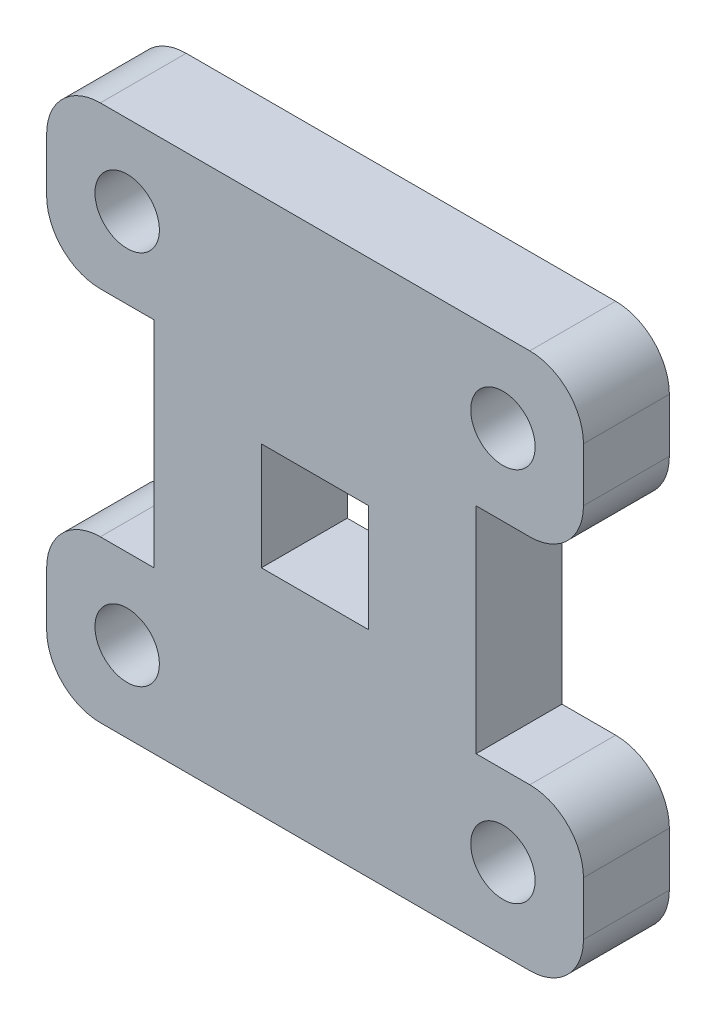
ISO-10303-21;
HEADER;
FILE_DESCRIPTION(('STEP AP214'),'2;1');
FILE_NAME('part.step','',(''),(''),'','','');
FILE_SCHEMA(('AUTOMOTIVE_DESIGN { 1 0 10303 214 1 1 1 1 }'));
ENDSEC;
DATA;
#1=APPLICATION_CONTEXT('core data for automotive mechanical design processes');
#2=APPLICATION_PROTOCOL_DEFINITION('international standard','automotive_design',2000,#1);
#3=PRODUCT_CONTEXT('',#1,'mechanical');
#4=PRODUCT('Part','Part','',(#3));
#5=PRODUCT_RELATED_PRODUCT_CATEGORY('part','',(#4));
#6=PRODUCT_DEFINITION_FORMATION('','',#4);
#7=PRODUCT_DEFINITION_CONTEXT('part definition',#1,'design');
#8=PRODUCT_DEFINITION('design','',#6,#7);
#9=PRODUCT_DEFINITION_SHAPE('','',#8);
#10=(LENGTH_UNIT() NAMED_UNIT(*) SI_UNIT(.MILLI.,.METRE.));
#11=(NAMED_UNIT(*) PLANE_ANGLE_UNIT() SI_UNIT($,.RADIAN.));
#12=(NAMED_UNIT(*) SI_UNIT($,.STERADIAN.) SOLID_ANGLE_UNIT());
#13=UNCERTAINTY_MEASURE_WITH_UNIT(LENGTH_MEASURE(1.E-05),#10,'distance_accuracy_value','');
#14=(GEOMETRIC_REPRESENTATION_CONTEXT(3) GLOBAL_UNCERTAINTY_ASSIGNED_CONTEXT((#13)) GLOBAL_UNIT_ASSIGNED_CONTEXT((#10,
#11,#12)) REPRESENTATION_CONTEXT('',''));
#15=CARTESIAN_POINT('',(0.,0.,0.));
#16=DIRECTION('',(0.,0.,1.));
#17=DIRECTION('',(1.,0.,0.));
#18=AXIS2_PLACEMENT_3D('',#15,#16,#17);
#19=CARTESIAN_POINT('',(-40.,-30.,16.));
#20=DIRECTION('',(0.,0.,-1.));
#21=DIRECTION('',(-1.,0.,0.));
#22=AXIS2_PLACEMENT_3D('',#19,#20,#21);
#23=PLANE('',#22);
#24=CARTESIAN_POINT('',(-35.,35.,16.));
#25=DIRECTION('',(0.,0.,1.));
#26=DIRECTION('',(-1.,0.,0.));
#27=AXIS2_PLACEMENT_3D('',#24,#25,#26);
#28=CIRCLE('',#27,6.00000000000001);
#29=CARTESIAN_POINT('',(-41.,35.,16.));
#30=VERTEX_POINT('',#29);
#31=EDGE_CURVE('E233',#30,#30,#28,.T.);
#32=ORIENTED_EDGE('',*,*,#31,.F.);
#33=EDGE_LOOP('',(#32));
#34=FACE_BOUND('',#33,.T.);
#35=CARTESIAN_POINT('',(35.,35.,16.));
#36=DIRECTION('',(0.,0.,1.));
#37=DIRECTION('',(1.,0.,0.));
#38=AXIS2_PLACEMENT_3D('',#35,#36,#37);
#39=CIRCLE('',#38,6.00000000000001);
#40=CARTESIAN_POINT('',(41.,35.,16.));
#41=VERTEX_POINT('',#40);
#42=EDGE_CURVE('E239',#41,#41,#39,.T.);
#43=ORIENTED_EDGE('',*,*,#42,.F.);
#44=EDGE_LOOP('',(#43));
#45=FACE_BOUND('',#44,.T.);
#46=DIRECTION('',(0.,-1.,0.));
#47=VECTOR('',#46,1.);
#48=CARTESIAN_POINT('',(-30.,20.,16.));
#49=LINE('',#48,#47);
#50=CARTESIAN_POINT('',(-30.,20.,16.));
#51=VERTEX_POINT('',#50);
#52=CARTESIAN_POINT('',(-30.,-20.,16.));
#53=VERTEX_POINT('',#52);
#54=EDGE_CURVE('E245',#51,#53,#49,.T.);
#55=ORIENTED_EDGE('',*,*,#54,.T.);
#56=DIRECTION('',(-1.,0.,0.));
#57=VECTOR('',#56,1.);
#58=CARTESIAN_POINT('',(-39.9999999999999,-20.,16.));
#59=LINE('',#58,#57);
#60=CARTESIAN_POINT('',(-39.9999999999999,-20.,16.));
#61=VERTEX_POINT('',#60);
#62=EDGE_CURVE('E248',#53,#61,#59,.T.);
#63=ORIENTED_EDGE('',*,*,#62,.T.);
#64=CARTESIAN_POINT('',(-40.,-30.,16.));
#65=DIRECTION('',(0.,0.,1.));
#66=DIRECTION('',(-1.,0.,0.));
#67=AXIS2_PLACEMENT_3D('',#64,#65,#66);
#68=CIRCLE('',#67,10.);
#69=CARTESIAN_POINT('',(-50.,-30.0000000000001,16.));
#70=VERTEX_POINT('',#69);
#71=EDGE_CURVE('E251',#61,#70,#68,.T.);
#72=ORIENTED_EDGE('',*,*,#71,.T.);
#73=DIRECTION('',(0.,-1.,0.));
#74=VECTOR('',#73,1.);
#75=CARTESIAN_POINT('',(-50.,-30.0000000000001,16.));
#76=LINE('',#75,#74);
#77=CARTESIAN_POINT('',(-50.,-39.9999999999999,16.));
#78=VERTEX_POINT('',#77);
#79=EDGE_CURVE('E253',#70,#78,#76,.T.);
#80=ORIENTED_EDGE('',*,*,#79,.T.);
#81=CARTESIAN_POINT('',(-40.,-40.,16.));
#82=DIRECTION('',(0.,0.,1.));
#83=DIRECTION('',(1.,0.,0.));
#84=AXIS2_PLACEMENT_3D('',#81,#82,#83);
#85=CIRCLE('',#84,10.);
#86=CARTESIAN_POINT('',(-39.9999999999999,-50.,16.));
#87=VERTEX_POINT('',#86);
#88=EDGE_CURVE('E255',#78,#87,#85,.T.);
#89=ORIENTED_EDGE('',*,*,#88,.T.);
#90=DIRECTION('',(1.,0.,0.));
#91=VECTOR('',#90,1.);
#92=CARTESIAN_POINT('',(-39.9999999999999,-50.,16.));
#93=LINE('',#92,#91);
#94=CARTESIAN_POINT('',(39.9999999999999,-50.,16.));
#95=VERTEX_POINT('',#94);
#96=EDGE_CURVE('E257',#87,#95,#93,.T.);
#97=ORIENTED_EDGE('',*,*,#96,.T.);
#98=CARTESIAN_POINT('',(40.,-40.,16.));
#99=DIRECTION('',(0.,0.,1.));
#100=DIRECTION('',(1.,0.,0.));
#101=AXIS2_PLACEMENT_3D('',#98,#99,#100);
#102=CIRCLE('',#101,10.);
#103=CARTESIAN_POINT('',(50.,-39.9999999999999,16.));
#104=VERTEX_POINT('',#103);
#105=EDGE_CURVE('E259',#95,#104,#102,.T.);
#106=ORIENTED_EDGE('',*,*,#105,.T.);
#107=DIRECTION('',(0.,1.,0.));
#108=VECTOR('',#107,1.);
#109=CARTESIAN_POINT('',(50.,-30.0000000000001,16.));
#110=LINE('',#109,#108);
#111=CARTESIAN_POINT('',(50.,-30.0000000000001,16.));
#112=VERTEX_POINT('',#111);
#113=EDGE_CURVE('E261',#104,#112,#110,.T.);
#114=ORIENTED_EDGE('',*,*,#113,.T.);
#115=CARTESIAN_POINT('',(40.,-30.,16.));
#116=DIRECTION('',(0.,0.,1.));
#117=DIRECTION('',(1.,0.,0.));
#118=AXIS2_PLACEMENT_3D('',#115,#116,#117);
#119=CIRCLE('',#118,10.);
#120=CARTESIAN_POINT('',(39.9999999999999,-20.,16.));
#121=VERTEX_POINT('',#120);
#122=EDGE_CURVE('E263',#112,#121,#119,.T.);
#123=ORIENTED_EDGE('',*,*,#122,.T.);
#124=DIRECTION('',(-1.,0.,0.));
#125=VECTOR('',#124,1.);
#126=CARTESIAN_POINT('',(39.9999999999999,-20.,16.));
#127=LINE('',#126,#125);
#128=CARTESIAN_POINT('',(30.,-20.,16.));
#129=VERTEX_POINT('',#128);
#130=EDGE_CURVE('E265',#121,#129,#127,.T.);
#131=ORIENTED_EDGE('',*,*,#130,.T.);
#132=DIRECTION('',(0.,1.,0.));
#133=VECTOR('',#132,1.);
#134=CARTESIAN_POINT('',(30.,20.,16.));
#135=LINE('',#134,#133);
#136=CARTESIAN_POINT('',(30.,20.,16.));
#137=VERTEX_POINT('',#136);
#138=EDGE_CURVE('E267',#129,#137,#135,.T.);
#139=ORIENTED_EDGE('',*,*,#138,.T.);
#140=DIRECTION('',(1.,0.,0.));
#141=VECTOR('',#140,1.);
#142=CARTESIAN_POINT('',(39.9999999999999,20.,16.));
#143=LINE('',#142,#141);
#144=CARTESIAN_POINT('',(39.9999999999999,20.,16.));
#145=VERTEX_POINT('',#144);
#146=EDGE_CURVE('E269',#137,#145,#143,.T.);
#147=ORIENTED_EDGE('',*,*,#146,.T.);
#148=CARTESIAN_POINT('',(40.,30.,16.));
#149=DIRECTION('',(0.,0.,1.));
#150=DIRECTION('',(-1.,0.,0.));
#151=AXIS2_PLACEMENT_3D('',#148,#149,#150);
#152=CIRCLE('',#151,10.);
#153=CARTESIAN_POINT('',(50.,30.0000000000001,16.));
#154=VERTEX_POINT('',#153);
#155=EDGE_CURVE('E271',#145,#154,#152,.T.);
#156=ORIENTED_EDGE('',*,*,#155,.T.);
#157=DIRECTION('',(0.,1.,0.));
#158=VECTOR('',#157,1.);
#159=CARTESIAN_POINT('',(50.,30.0000000000001,16.));
#160=LINE('',#159,#158);
#161=CARTESIAN_POINT('',(50.,39.9999999999999,16.));
#162=VERTEX_POINT('',#161);
#163=EDGE_CURVE('E273',#154,#162,#160,.T.);
#164=ORIENTED_EDGE('',*,*,#163,.T.);
#165=CARTESIAN_POINT('',(40.,40.,16.));
#166=DIRECTION('',(0.,0.,1.));
#167=DIRECTION('',(-1.,0.,0.));
#168=AXIS2_PLACEMENT_3D('',#165,#166,#167);
#169=CIRCLE('',#168,10.);
#170=CARTESIAN_POINT('',(39.9999999999999,50.,16.));
#171=VERTEX_POINT('',#170);
#172=EDGE_CURVE('E275',#162,#171,#169,.T.);
#173=ORIENTED_EDGE('',*,*,#172,.T.);
#174=DIRECTION('',(-1.,0.,0.));
#175=VECTOR('',#174,1.);
#176=CARTESIAN_POINT('',(-39.9999999999999,50.,16.));
#177=LINE('',#176,#175);
#178=CARTESIAN_POINT('',(-39.9999999999999,50.,16.));
#179=VERTEX_POINT('',#178);
#180=EDGE_CURVE('E277',#171,#179,#177,.T.);
#181=ORIENTED_EDGE('',*,*,#180,.T.);
#182=CARTESIAN_POINT('',(-40.,40.,16.));
#183=DIRECTION('',(0.,0.,1.));
#184=DIRECTION('',(-1.,0.,0.));
#185=AXIS2_PLACEMENT_3D('',#182,#183,#184);
#186=CIRCLE('',#185,10.);
#187=CARTESIAN_POINT('',(-50.,39.9999999999999,16.));
#188=VERTEX_POINT('',#187);
#189=EDGE_CURVE('E279',#179,#188,#186,.T.);
#190=ORIENTED_EDGE('',*,*,#189,.T.);
#191=DIRECTION('',(0.,-1.,0.));
#192=VECTOR('',#191,1.);
#193=CARTESIAN_POINT('',(-50.,30.0000000000001,16.));
#194=LINE('',#193,#192);
#195=CARTESIAN_POINT('',(-50.,30.0000000000001,16.));
#196=VERTEX_POINT('',#195);
#197=EDGE_CURVE('E281',#188,#196,#194,.T.);
#198=ORIENTED_EDGE('',*,*,#197,.T.);
#199=CARTESIAN_POINT('',(-40.,30.,16.));
#200=DIRECTION('',(0.,0.,1.));
#201=DIRECTION('',(1.,0.,0.));
#202=AXIS2_PLACEMENT_3D('',#199,#200,#201);
#203=CIRCLE('',#202,10.);
#204=CARTESIAN_POINT('',(-39.9999999999999,20.,16.));
#205=VERTEX_POINT('',#204);
#206=EDGE_CURVE('E283',#196,#205,#203,.T.);
#207=ORIENTED_EDGE('',*,*,#206,.T.);
#208=DIRECTION('',(1.,0.,0.));
#209=VECTOR('',#208,1.);
#210=CARTESIAN_POINT('',(-39.9999999999999,20.,16.));
#211=LINE('',#210,#209);
#212=EDGE_CURVE('E285',#205,#51,#211,.T.);
#213=ORIENTED_EDGE('',*,*,#212,.T.);
#214=EDGE_LOOP('',(#55,#63,#72,#80,#89,#97,#106,#114,#123,#131,#139,#147,#156,#164,#173,#181,
#190,#198,#207,#213));
#215=FACE_BOUND('',#214,.T.);
#216=DIRECTION('',(1.,0.,0.));
#217=VECTOR('',#216,1.);
#218=CARTESIAN_POINT('',(10.,-10.,16.));
#219=LINE('',#218,#217);
#220=CARTESIAN_POINT('',(-10.,-10.,16.));
#221=VERTEX_POINT('',#220);
#222=CARTESIAN_POINT('',(10.,-10.,16.));
#223=VERTEX_POINT('',#222);
#224=EDGE_CURVE('E194',#221,#223,#219,.T.);
#225=ORIENTED_EDGE('',*,*,#224,.F.);
#226=DIRECTION('',(0.,-1.,0.));
#227=VECTOR('',#226,1.);
#228=CARTESIAN_POINT('',(-10.,10.,16.));
#229=LINE('',#228,#227);
#230=CARTESIAN_POINT('',(-10.,9.99999999999999,16.));
#231=VERTEX_POINT('',#230);
#232=EDGE_CURVE('E217',#231,#221,#229,.T.);
#233=ORIENTED_EDGE('',*,*,#232,.F.);
#234=DIRECTION('',(-1.,0.,0.));
#235=VECTOR('',#234,1.);
#236=CARTESIAN_POINT('',(10.,10.,16.));
#237=LINE('',#236,#235);
#238=CARTESIAN_POINT('',(10.,10.,16.));
#239=VERTEX_POINT('',#238);
#240=EDGE_CURVE('E215',#239,#231,#237,.T.);
#241=ORIENTED_EDGE('',*,*,#240,.F.);
#242=DIRECTION('',(0.,1.,0.));
#243=VECTOR('',#242,1.);
#244=CARTESIAN_POINT('',(10.,-10.,16.));
#245=LINE('',#244,#243);
#246=EDGE_CURVE('E202',#223,#239,#245,.T.);
#247=ORIENTED_EDGE('',*,*,#246,.F.);
#248=EDGE_LOOP('',(#225,#233,#241,#247));
#249=FACE_BOUND('',#248,.T.);
#250=CARTESIAN_POINT('',(35.,-35.,16.));
#251=DIRECTION('',(0.,0.,1.));
#252=DIRECTION('',(-1.,0.,0.));
#253=AXIS2_PLACEMENT_3D('',#250,#251,#252);
#254=CIRCLE('',#253,6.00000000000001);
#255=CARTESIAN_POINT('',(29.,-35.,16.));
#256=VERTEX_POINT('',#255);
#257=EDGE_CURVE('E223',#256,#256,#254,.T.);
#258=ORIENTED_EDGE('',*,*,#257,.F.);
#259=EDGE_LOOP('',(#258));
#260=FACE_BOUND('',#259,.T.);
#261=CARTESIAN_POINT('',(-35.,-35.,16.));
#262=DIRECTION('',(0.,0.,1.));
#263=DIRECTION('',(1.,0.,0.));
#264=AXIS2_PLACEMENT_3D('',#261,#262,#263);
#265=CIRCLE('',#264,6.00000000000001);
#266=CARTESIAN_POINT('',(-29.,-35.,16.));
#267=VERTEX_POINT('',#266);
#268=EDGE_CURVE('E737',#267,#267,#265,.T.);
#269=ORIENTED_EDGE('',*,*,#268,.F.);
#270=EDGE_LOOP('',(#269));
#271=FACE_BOUND('',#270,.T.);
#272=ADVANCED_FACE('F33',(#34,#45,#215,#249,#260,#271),#23,.F.);
#273=CARTESIAN_POINT('',(-40.,-30.,0.));
#274=DIRECTION('',(0.,0.,-1.));
#275=DIRECTION('',(-1.,0.,0.));
#276=AXIS2_PLACEMENT_3D('',#273,#274,#275);
#277=PLANE('',#276);
#278=CARTESIAN_POINT('',(35.,-35.,0.));
#279=DIRECTION('',(0.,0.,1.));
#280=DIRECTION('',(-1.,0.,0.));
#281=AXIS2_PLACEMENT_3D('',#278,#279,#280);
#282=CIRCLE('',#281,6.00000000000001);
#283=CARTESIAN_POINT('',(29.,-35.,0.));
#284=VERTEX_POINT('',#283);
#285=EDGE_CURVE('E743',#284,#284,#282,.T.);
#286=ORIENTED_EDGE('',*,*,#285,.T.);
#287=EDGE_LOOP('',(#286));
#288=FACE_BOUND('',#287,.T.);
#289=CARTESIAN_POINT('',(35.,35.,0.));
#290=DIRECTION('',(0.,0.,1.));
#291=DIRECTION('',(1.,0.,0.));
#292=AXIS2_PLACEMENT_3D('',#289,#290,#291);
#293=CIRCLE('',#292,6.00000000000001);
#294=CARTESIAN_POINT('',(41.,35.,0.));
#295=VERTEX_POINT('',#294);
#296=EDGE_CURVE('E236',#295,#295,#293,.T.);
#297=ORIENTED_EDGE('',*,*,#296,.T.);
#298=EDGE_LOOP('',(#297));
#299=FACE_BOUND('',#298,.T.);
#300=DIRECTION('',(0.,-1.,0.));
#301=VECTOR('',#300,1.);
#302=CARTESIAN_POINT('',(-30.,20.,0.));
#303=LINE('',#302,#301);
#304=CARTESIAN_POINT('',(-30.,20.,0.));
#305=VERTEX_POINT('',#304);
#306=CARTESIAN_POINT('',(-30.,-20.,0.));
#307=VERTEX_POINT('',#306);
#308=EDGE_CURVE('E242',#305,#307,#303,.T.);
#309=ORIENTED_EDGE('',*,*,#308,.F.);
#310=DIRECTION('',(1.,0.,0.));
#311=VECTOR('',#310,1.);
#312=CARTESIAN_POINT('',(-39.9999999999999,20.,0.));
#313=LINE('',#312,#311);
#314=CARTESIAN_POINT('',(-39.9999999999999,20.,0.));
#315=VERTEX_POINT('',#314);
#316=EDGE_CURVE('E249',#315,#305,#313,.T.);
#317=ORIENTED_EDGE('',*,*,#316,.F.);
#318=CARTESIAN_POINT('',(-40.,30.,0.));
#319=DIRECTION('',(0.,0.,1.));
#320=DIRECTION('',(1.,0.,0.));
#321=AXIS2_PLACEMENT_3D('',#318,#319,#320);
#322=CIRCLE('',#321,10.);
#323=CARTESIAN_POINT('',(-50.,30.0000000000001,0.));
#324=VERTEX_POINT('',#323);
#325=EDGE_CURVE('E324',#324,#315,#322,.T.);
#326=ORIENTED_EDGE('',*,*,#325,.F.);
#327=DIRECTION('',(0.,-1.,0.));
#328=VECTOR('',#327,1.);
#329=CARTESIAN_POINT('',(-50.,30.0000000000001,0.));
#330=LINE('',#329,#328);
#331=CARTESIAN_POINT('',(-50.,39.9999999999999,0.));
#332=VERTEX_POINT('',#331);
#333=EDGE_CURVE('E322',#332,#324,#330,.T.);
#334=ORIENTED_EDGE('',*,*,#333,.F.);
#335=CARTESIAN_POINT('',(-40.,40.,0.));
#336=DIRECTION('',(0.,0.,1.));
#337=DIRECTION('',(-1.,0.,0.));
#338=AXIS2_PLACEMENT_3D('',#335,#336,#337);
#339=CIRCLE('',#338,10.);
#340=CARTESIAN_POINT('',(-39.9999999999999,50.,0.));
#341=VERTEX_POINT('',#340);
#342=EDGE_CURVE('E320',#341,#332,#339,.T.);
#343=ORIENTED_EDGE('',*,*,#342,.F.);
#344=DIRECTION('',(-1.,0.,0.));
#345=VECTOR('',#344,1.);
#346=CARTESIAN_POINT('',(-39.9999999999999,50.,0.));
#347=LINE('',#346,#345);
#348=CARTESIAN_POINT('',(39.9999999999999,50.,0.));
#349=VERTEX_POINT('',#348);
#350=EDGE_CURVE('E318',#349,#341,#347,.T.);
#351=ORIENTED_EDGE('',*,*,#350,.F.);
#352=CARTESIAN_POINT('',(40.,40.,0.));
#353=DIRECTION('',(0.,0.,1.));
#354=DIRECTION('',(-1.,0.,0.));
#355=AXIS2_PLACEMENT_3D('',#352,#353,#354);
#356=CIRCLE('',#355,10.);
#357=CARTESIAN_POINT('',(50.,39.9999999999999,0.));
#358=VERTEX_POINT('',#357);
#359=EDGE_CURVE('E316',#358,#349,#356,.T.);
#360=ORIENTED_EDGE('',*,*,#359,.F.);
#361=DIRECTION('',(0.,1.,0.));
#362=VECTOR('',#361,1.);
#363=CARTESIAN_POINT('',(50.,30.0000000000001,0.));
#364=LINE('',#363,#362);
#365=CARTESIAN_POINT('',(50.,30.0000000000001,0.));
#366=VERTEX_POINT('',#365);
#367=EDGE_CURVE('E314',#366,#358,#364,.T.);
#368=ORIENTED_EDGE('',*,*,#367,.F.);
#369=CARTESIAN_POINT('',(40.,30.,0.));
#370=DIRECTION('',(0.,0.,1.));
#371=DIRECTION('',(-1.,0.,0.));
#372=AXIS2_PLACEMENT_3D('',#369,#370,#371);
#373=CIRCLE('',#372,10.);
#374=CARTESIAN_POINT('',(39.9999999999999,20.,0.));
#375=VERTEX_POINT('',#374);
#376=EDGE_CURVE('E312',#375,#366,#373,.T.);
#377=ORIENTED_EDGE('',*,*,#376,.F.);
#378=DIRECTION('',(1.,0.,0.));
#379=VECTOR('',#378,1.);
#380=CARTESIAN_POINT('',(39.9999999999999,20.,0.));
#381=LINE('',#380,#379);
#382=CARTESIAN_POINT('',(30.,20.,0.));
#383=VERTEX_POINT('',#382);
#384=EDGE_CURVE('E310',#383,#375,#381,.T.);
#385=ORIENTED_EDGE('',*,*,#384,.F.);
#386=DIRECTION('',(0.,1.,0.));
#387=VECTOR('',#386,1.);
#388=CARTESIAN_POINT('',(30.,20.,0.));
#389=LINE('',#388,#387);
#390=CARTESIAN_POINT('',(30.,-20.,0.));
#391=VERTEX_POINT('',#390);
#392=EDGE_CURVE('E308',#391,#383,#389,.T.);
#393=ORIENTED_EDGE('',*,*,#392,.F.);
#394=DIRECTION('',(-1.,0.,0.));
#395=VECTOR('',#394,1.);
#396=CARTESIAN_POINT('',(39.9999999999999,-20.,0.));
#397=LINE('',#396,#395);
#398=CARTESIAN_POINT('',(39.9999999999999,-20.,0.));
#399=VERTEX_POINT('',#398);
#400=EDGE_CURVE('E306',#399,#391,#397,.T.);
#401=ORIENTED_EDGE('',*,*,#400,.F.);
#402=CARTESIAN_POINT('',(40.,-30.,0.));
#403=DIRECTION('',(0.,0.,1.));
#404=DIRECTION('',(1.,0.,0.));
#405=AXIS2_PLACEMENT_3D('',#402,#403,#404);
#406=CIRCLE('',#405,10.);
#407=CARTESIAN_POINT('',(50.,-30.0000000000001,0.));
#408=VERTEX_POINT('',#407);
#409=EDGE_CURVE('E304',#408,#399,#406,.T.);
#410=ORIENTED_EDGE('',*,*,#409,.F.);
#411=DIRECTION('',(0.,1.,0.));
#412=VECTOR('',#411,1.);
#413=CARTESIAN_POINT('',(50.,-30.0000000000001,0.));
#414=LINE('',#413,#412);
#415=CARTESIAN_POINT('',(50.,-39.9999999999999,0.));
#416=VERTEX_POINT('',#415);
#417=EDGE_CURVE('E302',#416,#408,#414,.T.);
#418=ORIENTED_EDGE('',*,*,#417,.F.);
#419=CARTESIAN_POINT('',(40.,-40.,0.));
#420=DIRECTION('',(0.,0.,1.));
#421=DIRECTION('',(1.,0.,0.));
#422=AXIS2_PLACEMENT_3D('',#419,#420,#421);
#423=CIRCLE('',#422,10.);
#424=CARTESIAN_POINT('',(39.9999999999999,-50.,0.));
#425=VERTEX_POINT('',#424);
#426=EDGE_CURVE('E300',#425,#416,#423,.T.);
#427=ORIENTED_EDGE('',*,*,#426,.F.);
#428=DIRECTION('',(1.,0.,0.));
#429=VECTOR('',#428,1.);
#430=CARTESIAN_POINT('',(-39.9999999999999,-50.,0.));
#431=LINE('',#430,#429);
#432=CARTESIAN_POINT('',(-39.9999999999999,-50.,0.));
#433=VERTEX_POINT('',#432);
#434=EDGE_CURVE('E298',#433,#425,#431,.T.);
#435=ORIENTED_EDGE('',*,*,#434,.F.);
#436=CARTESIAN_POINT('',(-40.,-40.,0.));
#437=DIRECTION('',(0.,0.,1.));
#438=DIRECTION('',(1.,0.,0.));
#439=AXIS2_PLACEMENT_3D('',#436,#437,#438);
#440=CIRCLE('',#439,10.);
#441=CARTESIAN_POINT('',(-50.,-39.9999999999999,0.));
#442=VERTEX_POINT('',#441);
#443=EDGE_CURVE('E296',#442,#433,#440,.T.);
#444=ORIENTED_EDGE('',*,*,#443,.F.);
#445=DIRECTION('',(0.,-1.,0.));
#446=VECTOR('',#445,1.);
#447=CARTESIAN_POINT('',(-50.,-30.0000000000001,0.));
#448=LINE('',#447,#446);
#449=CARTESIAN_POINT('',(-50.,-30.0000000000001,0.));
#450=VERTEX_POINT('',#449);
#451=EDGE_CURVE('E294',#450,#442,#448,.T.);
#452=ORIENTED_EDGE('',*,*,#451,.F.);
#453=CARTESIAN_POINT('',(-40.,-30.,0.));
#454=DIRECTION('',(0.,0.,1.));
#455=DIRECTION('',(-1.,0.,0.));
#456=AXIS2_PLACEMENT_3D('',#453,#454,#455);
#457=CIRCLE('',#456,10.);
#458=CARTESIAN_POINT('',(-39.9999999999999,-20.,0.));
#459=VERTEX_POINT('',#458);
#460=EDGE_CURVE('E292',#459,#450,#457,.T.);
#461=ORIENTED_EDGE('',*,*,#460,.F.);
#462=DIRECTION('',(-1.,0.,0.));
#463=VECTOR('',#462,1.);
#464=CARTESIAN_POINT('',(-39.9999999999999,-20.,0.));
#465=LINE('',#464,#463);
#466=EDGE_CURVE('E290',#307,#459,#465,.T.);
#467=ORIENTED_EDGE('',*,*,#466,.F.);
#468=EDGE_LOOP('',(#309,#317,#326,#334,#343,#351,#360,#368,#377,#385,#393,#401,#410,#418,#427,
#435,#444,#452,#461,#467));
#469=FACE_BOUND('',#468,.T.);
#470=CARTESIAN_POINT('',(-35.,35.,0.));
#471=DIRECTION('',(0.,0.,1.));
#472=DIRECTION('',(-1.,0.,0.));
#473=AXIS2_PLACEMENT_3D('',#470,#471,#472);
#474=CIRCLE('',#473,6.00000000000001);
#475=CARTESIAN_POINT('',(-41.,35.,0.));
#476=VERTEX_POINT('',#475);
#477=EDGE_CURVE('E210',#476,#476,#474,.T.);
#478=ORIENTED_EDGE('',*,*,#477,.T.);
#479=EDGE_LOOP('',(#478));
#480=FACE_BOUND('',#479,.T.);
#481=DIRECTION('',(0.,-1.,0.));
#482=VECTOR('',#481,1.);
#483=CARTESIAN_POINT('',(-10.,10.,0.));
#484=LINE('',#483,#482);
#485=CARTESIAN_POINT('',(-10.,10.,0.));
#486=VERTEX_POINT('',#485);
#487=CARTESIAN_POINT('',(-10.,-9.99999999999999,0.));
#488=VERTEX_POINT('',#487);
#489=EDGE_CURVE('E203',#486,#488,#484,.T.);
#490=ORIENTED_EDGE('',*,*,#489,.T.);
#491=DIRECTION('',(1.,0.,0.));
#492=VECTOR('',#491,1.);
#493=CARTESIAN_POINT('',(10.,-10.,0.));
#494=LINE('',#493,#492);
#495=CARTESIAN_POINT('',(10.,-10.,0.));
#496=VERTEX_POINT('',#495);
#497=EDGE_CURVE('E56',#488,#496,#494,.T.);
#498=ORIENTED_EDGE('',*,*,#497,.T.);
#499=DIRECTION('',(0.,1.,0.));
#500=VECTOR('',#499,1.);
#501=CARTESIAN_POINT('',(10.,-10.,0.));
#502=LINE('',#501,#500);
#503=CARTESIAN_POINT('',(10.,10.,0.));
#504=VERTEX_POINT('',#503);
#505=EDGE_CURVE('E209',#496,#504,#502,.T.);
#506=ORIENTED_EDGE('',*,*,#505,.T.);
#507=DIRECTION('',(-1.,0.,0.));
#508=VECTOR('',#507,1.);
#509=CARTESIAN_POINT('',(10.,10.,0.));
#510=LINE('',#509,#508);
#511=EDGE_CURVE('E225',#504,#486,#510,.T.);
#512=ORIENTED_EDGE('',*,*,#511,.T.);
#513=EDGE_LOOP('',(#490,#498,#506,#512));
#514=FACE_BOUND('',#513,.T.);
#515=CARTESIAN_POINT('',(-35.,-35.,0.));
#516=DIRECTION('',(0.,0.,1.));
#517=DIRECTION('',(1.,0.,0.));
#518=AXIS2_PLACEMENT_3D('',#515,#516,#517);
#519=CIRCLE('',#518,6.00000000000001);
#520=CARTESIAN_POINT('',(-29.,-35.,0.));
#521=VERTEX_POINT('',#520);
#522=EDGE_CURVE('E740',#521,#521,#519,.T.);
#523=ORIENTED_EDGE('',*,*,#522,.T.);
#524=EDGE_LOOP('',(#523));
#525=FACE_BOUND('',#524,.T.);
#526=ADVANCED_FACE('F390',(#288,#299,#469,#480,#514,#525),#277,.T.);
#527=CARTESIAN_POINT('',(-30.,20.,16.));
#528=DIRECTION('',(1.,0.,0.));
#529=DIRECTION('',(0.,0.,-1.));
#530=AXIS2_PLACEMENT_3D('',#527,#528,#529);
#531=PLANE('',#530);
#532=ORIENTED_EDGE('',*,*,#308,.T.);
#533=DIRECTION('',(0.,0.,-1.));
#534=VECTOR('',#533,1.);
#535=CARTESIAN_POINT('',(-30.,-20.,16.));
#536=LINE('',#535,#534);
#537=EDGE_CURVE('E11',#53,#307,#536,.T.);
#538=ORIENTED_EDGE('',*,*,#537,.F.);
#539=ORIENTED_EDGE('',*,*,#54,.F.);
#540=DIRECTION('',(0.,0.,-1.));
#541=VECTOR('',#540,1.);
#542=CARTESIAN_POINT('',(-30.,20.,16.));
#543=LINE('',#542,#541);
#544=EDGE_CURVE('E287',#51,#305,#543,.T.);
#545=ORIENTED_EDGE('',*,*,#544,.T.);
#546=EDGE_LOOP('',(#532,#538,#539,#545));
#547=FACE_BOUND('',#546,.T.);
#548=ADVANCED_FACE('F35',(#547),#531,.F.);
#549=CARTESIAN_POINT('',(-39.9999999999999,-20.,16.));
#550=DIRECTION('',(0.,-1.,0.));
#551=DIRECTION('',(0.,0.,-1.));
#552=AXIS2_PLACEMENT_3D('',#549,#550,#551);
#553=PLANE('',#552);
#554=ORIENTED_EDGE('',*,*,#466,.T.);
#555=DIRECTION('',(0.,0.,-1.));
#556=VECTOR('',#555,1.);
#557=CARTESIAN_POINT('',(-39.9999999999999,-20.,16.));
#558=LINE('',#557,#556);
#559=EDGE_CURVE('E41',#61,#459,#558,.T.);
#560=ORIENTED_EDGE('',*,*,#559,.F.);
#561=ORIENTED_EDGE('',*,*,#62,.F.);
#562=ORIENTED_EDGE('',*,*,#537,.T.);
#563=EDGE_LOOP('',(#554,#560,#561,#562));
#564=FACE_BOUND('',#563,.T.);
#565=ADVANCED_FACE('F407',(#564),#553,.F.);
#566=CARTESIAN_POINT('',(-40.,-30.,16.));
#567=DIRECTION('',(0.,0.,-1.));
#568=DIRECTION('',(-1.,0.,0.));
#569=AXIS2_PLACEMENT_3D('',#566,#567,#568);
#570=CYLINDRICAL_SURFACE('',#569,10.);
#571=ORIENTED_EDGE('',*,*,#460,.T.);
#572=DIRECTION('',(0.,0.,-1.));
#573=VECTOR('',#572,1.);
#574=CARTESIAN_POINT('',(-50.,-30.0000000000001,16.));
#575=LINE('',#574,#573);
#576=EDGE_CURVE('E377',#70,#450,#575,.T.);
#577=ORIENTED_EDGE('',*,*,#576,.F.);
#578=ORIENTED_EDGE('',*,*,#71,.F.);
#579=ORIENTED_EDGE('',*,*,#559,.T.);
#580=EDGE_LOOP('',(#571,#577,#578,#579));
#581=FACE_BOUND('',#580,.T.);
#582=ADVANCED_FACE('F384',(#581),#570,.T.);
#583=CARTESIAN_POINT('',(-50.,-30.0000000000001,16.));
#584=DIRECTION('',(1.,0.,0.));
#585=DIRECTION('',(0.,0.,-1.));
#586=AXIS2_PLACEMENT_3D('',#583,#584,#585);
#587=PLANE('',#586);
#588=ORIENTED_EDGE('',*,*,#451,.T.);
#589=DIRECTION('',(0.,0.,-1.));
#590=VECTOR('',#589,1.);
#591=CARTESIAN_POINT('',(-50.,-39.9999999999999,16.));
#592=LINE('',#591,#590);
#593=EDGE_CURVE('E374',#78,#442,#592,.T.);
#594=ORIENTED_EDGE('',*,*,#593,.F.);
#595=ORIENTED_EDGE('',*,*,#79,.F.);
#596=ORIENTED_EDGE('',*,*,#576,.T.);
#597=EDGE_LOOP('',(#588,#594,#595,#596));
#598=FACE_BOUND('',#597,.T.);
#599=ADVANCED_FACE('F396',(#598),#587,.F.);
#600=CARTESIAN_POINT('',(-40.,-40.,16.));
#601=DIRECTION('',(0.,0.,-1.));
#602=DIRECTION('',(-1.,0.,0.));
#603=AXIS2_PLACEMENT_3D('',#600,#601,#602);
#604=CYLINDRICAL_SURFACE('',#603,10.);
#605=ORIENTED_EDGE('',*,*,#443,.T.);
#606=DIRECTION('',(0.,0.,-1.));
#607=VECTOR('',#606,1.);
#608=CARTESIAN_POINT('',(-39.9999999999999,-50.,16.));
#609=LINE('',#608,#607);
#610=EDGE_CURVE('E371',#87,#433,#609,.T.);
#611=ORIENTED_EDGE('',*,*,#610,.F.);
#612=ORIENTED_EDGE('',*,*,#88,.F.);
#613=ORIENTED_EDGE('',*,*,#593,.T.);
#614=EDGE_LOOP('',(#605,#611,#612,#613));
#615=FACE_BOUND('',#614,.T.);
#616=ADVANCED_FACE('F400',(#615),#604,.T.);
#617=CARTESIAN_POINT('',(-39.9999999999999,-50.,16.));
#618=DIRECTION('',(0.,1.,0.));
#619=DIRECTION('',(0.,0.,1.));
#620=AXIS2_PLACEMENT_3D('',#617,#618,#619);
#621=PLANE('',#620);
#622=ORIENTED_EDGE('',*,*,#434,.T.);
#623=DIRECTION('',(0.,0.,-1.));
#624=VECTOR('',#623,1.);
#625=CARTESIAN_POINT('',(39.9999999999999,-50.,16.));
#626=LINE('',#625,#624);
#627=EDGE_CURVE('E368',#95,#425,#626,.T.);
#628=ORIENTED_EDGE('',*,*,#627,.F.);
#629=ORIENTED_EDGE('',*,*,#96,.F.);
#630=ORIENTED_EDGE('',*,*,#610,.T.);
#631=EDGE_LOOP('',(#622,#628,#629,#630));
#632=FACE_BOUND('',#631,.T.);
#633=ADVANCED_FACE('F480',(#632),#621,.F.);
#634=CARTESIAN_POINT('',(40.,-40.,16.));
#635=DIRECTION('',(0.,0.,-1.));
#636=DIRECTION('',(-1.,0.,0.));
#637=AXIS2_PLACEMENT_3D('',#634,#635,#636);
#638=CYLINDRICAL_SURFACE('',#637,10.);
#639=ORIENTED_EDGE('',*,*,#426,.T.);
#640=DIRECTION('',(0.,0.,-1.));
#641=VECTOR('',#640,1.);
#642=CARTESIAN_POINT('',(50.,-39.9999999999999,16.));
#643=LINE('',#642,#641);
#644=EDGE_CURVE('E365',#104,#416,#643,.T.);
#645=ORIENTED_EDGE('',*,*,#644,.F.);
#646=ORIENTED_EDGE('',*,*,#105,.F.);
#647=ORIENTED_EDGE('',*,*,#627,.T.);
#648=EDGE_LOOP('',(#639,#645,#646,#647));
#649=FACE_BOUND('',#648,.T.);
#650=ADVANCED_FACE('F478',(#649),#638,.T.);
#651=CARTESIAN_POINT('',(50.,-30.0000000000001,16.));
#652=DIRECTION('',(-1.,0.,0.));
#653=DIRECTION('',(0.,0.,1.));
#654=AXIS2_PLACEMENT_3D('',#651,#652,#653);
#655=PLANE('',#654);
#656=ORIENTED_EDGE('',*,*,#417,.T.);
#657=DIRECTION('',(0.,0.,-1.));
#658=VECTOR('',#657,1.);
#659=CARTESIAN_POINT('',(50.,-30.0000000000001,16.));
#660=LINE('',#659,#658);
#661=EDGE_CURVE('E362',#112,#408,#660,.T.);
#662=ORIENTED_EDGE('',*,*,#661,.F.);
#663=ORIENTED_EDGE('',*,*,#113,.F.);
#664=ORIENTED_EDGE('',*,*,#644,.T.);
#665=EDGE_LOOP('',(#656,#662,#663,#664));
#666=FACE_BOUND('',#665,.T.);
#667=ADVANCED_FACE('F473',(#666),#655,.F.);
#668=CARTESIAN_POINT('',(40.,-30.,16.));
#669=DIRECTION('',(0.,0.,-1.));
#670=DIRECTION('',(-1.,0.,0.));
#671=AXIS2_PLACEMENT_3D('',#668,#669,#670);
#672=CYLINDRICAL_SURFACE('',#671,10.);
#673=ORIENTED_EDGE('',*,*,#409,.T.);
#674=DIRECTION('',(0.,0.,-1.));
#675=VECTOR('',#674,1.);
#676=CARTESIAN_POINT('',(39.9999999999999,-20.,16.));
#677=LINE('',#676,#675);
#678=EDGE_CURVE('E359',#121,#399,#677,.T.);
#679=ORIENTED_EDGE('',*,*,#678,.F.);
#680=ORIENTED_EDGE('',*,*,#122,.F.);
#681=ORIENTED_EDGE('',*,*,#661,.T.);
#682=EDGE_LOOP('',(#673,#679,#680,#681));
#683=FACE_BOUND('',#682,.T.);
#684=ADVANCED_FACE('F468',(#683),#672,.T.);
#685=CARTESIAN_POINT('',(39.9999999999999,-20.,16.));
#686=DIRECTION('',(0.,-1.,0.));
#687=DIRECTION('',(0.,0.,-1.));
#688=AXIS2_PLACEMENT_3D('',#685,#686,#687);
#689=PLANE('',#688);
#690=ORIENTED_EDGE('',*,*,#400,.T.);
#691=DIRECTION('',(0.,0.,-1.));
#692=VECTOR('',#691,1.);
#693=CARTESIAN_POINT('',(30.,-20.,16.));
#694=LINE('',#693,#692);
#695=EDGE_CURVE('E356',#129,#391,#694,.T.);
#696=ORIENTED_EDGE('',*,*,#695,.F.);
#697=ORIENTED_EDGE('',*,*,#130,.F.);
#698=ORIENTED_EDGE('',*,*,#678,.T.);
#699=EDGE_LOOP('',(#690,#696,#697,#698));
#700=FACE_BOUND('',#699,.T.);
#701=ADVANCED_FACE('F464',(#700),#689,.F.);
#702=CARTESIAN_POINT('',(30.,20.,16.));
#703=DIRECTION('',(-1.,0.,0.));
#704=DIRECTION('',(0.,0.,1.));
#705=AXIS2_PLACEMENT_3D('',#702,#703,#704);
#706=PLANE('',#705);
#707=ORIENTED_EDGE('',*,*,#392,.T.);
#708=DIRECTION('',(0.,0.,-1.));
#709=VECTOR('',#708,1.);
#710=CARTESIAN_POINT('',(30.,20.,16.));
#711=LINE('',#710,#709);
#712=EDGE_CURVE('E353',#137,#383,#711,.T.);
#713=ORIENTED_EDGE('',*,*,#712,.F.);
#714=ORIENTED_EDGE('',*,*,#138,.F.);
#715=ORIENTED_EDGE('',*,*,#695,.T.);
#716=EDGE_LOOP('',(#707,#713,#714,#715));
#717=FACE_BOUND('',#716,.T.);
#718=ADVANCED_FACE('F459',(#717),#706,.F.);
#719=CARTESIAN_POINT('',(39.9999999999999,20.,16.));
#720=DIRECTION('',(0.,1.,0.));
#721=DIRECTION('',(0.,0.,1.));
#722=AXIS2_PLACEMENT_3D('',#719,#720,#721);
#723=PLANE('',#722);
#724=ORIENTED_EDGE('',*,*,#384,.T.);
#725=DIRECTION('',(0.,0.,-1.));
#726=VECTOR('',#725,1.);
#727=CARTESIAN_POINT('',(39.9999999999999,20.,16.));
#728=LINE('',#727,#726);
#729=EDGE_CURVE('E350',#145,#375,#728,.T.);
#730=ORIENTED_EDGE('',*,*,#729,.F.);
#731=ORIENTED_EDGE('',*,*,#146,.F.);
#732=ORIENTED_EDGE('',*,*,#712,.T.);
#733=EDGE_LOOP('',(#724,#730,#731,#732));
#734=FACE_BOUND('',#733,.T.);
#735=ADVANCED_FACE('F453',(#734),#723,.F.);
#736=CARTESIAN_POINT('',(40.,30.,16.));
#737=DIRECTION('',(0.,0.,-1.));
#738=DIRECTION('',(-1.,0.,0.));
#739=AXIS2_PLACEMENT_3D('',#736,#737,#738);
#740=CYLINDRICAL_SURFACE('',#739,10.);
#741=ORIENTED_EDGE('',*,*,#376,.T.);
#742=DIRECTION('',(0.,0.,-1.));
#743=VECTOR('',#742,1.);
#744=CARTESIAN_POINT('',(50.,30.0000000000001,16.));
#745=LINE('',#744,#743);
#746=EDGE_CURVE('E347',#154,#366,#745,.T.);
#747=ORIENTED_EDGE('',*,*,#746,.F.);
#748=ORIENTED_EDGE('',*,*,#155,.F.);
#749=ORIENTED_EDGE('',*,*,#729,.T.);
#750=EDGE_LOOP('',(#741,#747,#748,#749));
#751=FACE_BOUND('',#750,.T.);
#752=ADVANCED_FACE('F449',(#751),#740,.T.);
#753=CARTESIAN_POINT('',(50.,30.0000000000001,16.));
#754=DIRECTION('',(-1.,0.,0.));
#755=DIRECTION('',(0.,0.,1.));
#756=AXIS2_PLACEMENT_3D('',#753,#754,#755);
#757=PLANE('',#756);
#758=ORIENTED_EDGE('',*,*,#367,.T.);
#759=DIRECTION('',(0.,0.,-1.));
#760=VECTOR('',#759,1.);
#761=CARTESIAN_POINT('',(50.,39.9999999999999,16.));
#762=LINE('',#761,#760);
#763=EDGE_CURVE('E344',#162,#358,#762,.T.);
#764=ORIENTED_EDGE('',*,*,#763,.F.);
#765=ORIENTED_EDGE('',*,*,#163,.F.);
#766=ORIENTED_EDGE('',*,*,#746,.T.);
#767=EDGE_LOOP('',(#758,#764,#765,#766));
#768=FACE_BOUND('',#767,.T.);
#769=ADVANCED_FACE('F444',(#768),#757,.F.);
#770=CARTESIAN_POINT('',(40.,40.,16.));
#771=DIRECTION('',(0.,0.,-1.));
#772=DIRECTION('',(-1.,0.,0.));
#773=AXIS2_PLACEMENT_3D('',#770,#771,#772);
#774=CYLINDRICAL_SURFACE('',#773,10.);
#775=ORIENTED_EDGE('',*,*,#359,.T.);
#776=DIRECTION('',(0.,0.,-1.));
#777=VECTOR('',#776,1.);
#778=CARTESIAN_POINT('',(39.9999999999999,50.,16.));
#779=LINE('',#778,#777);
#780=EDGE_CURVE('E341',#171,#349,#779,.T.);
#781=ORIENTED_EDGE('',*,*,#780,.F.);
#782=ORIENTED_EDGE('',*,*,#172,.F.);
#783=ORIENTED_EDGE('',*,*,#763,.T.);
#784=EDGE_LOOP('',(#775,#781,#782,#783));
#785=FACE_BOUND('',#784,.T.);
#786=ADVANCED_FACE('F438',(#785),#774,.T.);
#787=CARTESIAN_POINT('',(-39.9999999999999,50.,16.));
#788=DIRECTION('',(0.,-1.,0.));
#789=DIRECTION('',(0.,0.,-1.));
#790=AXIS2_PLACEMENT_3D('',#787,#788,#789);
#791=PLANE('',#790);
#792=ORIENTED_EDGE('',*,*,#350,.T.);
#793=DIRECTION('',(0.,0.,-1.));
#794=VECTOR('',#793,1.);
#795=CARTESIAN_POINT('',(-39.9999999999999,50.,16.));
#796=LINE('',#795,#794);
#797=EDGE_CURVE('E338',#179,#341,#796,.T.);
#798=ORIENTED_EDGE('',*,*,#797,.F.);
#799=ORIENTED_EDGE('',*,*,#180,.F.);
#800=ORIENTED_EDGE('',*,*,#780,.T.);
#801=EDGE_LOOP('',(#792,#798,#799,#800));
#802=FACE_BOUND('',#801,.T.);
#803=ADVANCED_FACE('F434',(#802),#791,.F.);
#804=CARTESIAN_POINT('',(-40.,40.,16.));
#805=DIRECTION('',(0.,0.,-1.));
#806=DIRECTION('',(-1.,0.,0.));
#807=AXIS2_PLACEMENT_3D('',#804,#805,#806);
#808=CYLINDRICAL_SURFACE('',#807,10.);
#809=ORIENTED_EDGE('',*,*,#342,.T.);
#810=DIRECTION('',(0.,0.,-1.));
#811=VECTOR('',#810,1.);
#812=CARTESIAN_POINT('',(-50.,39.9999999999999,16.));
#813=LINE('',#812,#811);
#814=EDGE_CURVE('E335',#188,#332,#813,.T.);
#815=ORIENTED_EDGE('',*,*,#814,.F.);
#816=ORIENTED_EDGE('',*,*,#189,.F.);
#817=ORIENTED_EDGE('',*,*,#797,.T.);
#818=EDGE_LOOP('',(#809,#815,#816,#817));
#819=FACE_BOUND('',#818,.T.);
#820=ADVANCED_FACE('F429',(#819),#808,.T.);
#821=CARTESIAN_POINT('',(-50.,30.0000000000001,16.));
#822=DIRECTION('',(1.,0.,0.));
#823=DIRECTION('',(0.,0.,-1.));
#824=AXIS2_PLACEMENT_3D('',#821,#822,#823);
#825=PLANE('',#824);
#826=ORIENTED_EDGE('',*,*,#333,.T.);
#827=DIRECTION('',(0.,0.,-1.));
#828=VECTOR('',#827,1.);
#829=CARTESIAN_POINT('',(-50.,30.0000000000001,16.));
#830=LINE('',#829,#828);
#831=EDGE_CURVE('E332',#196,#324,#830,.T.);
#832=ORIENTED_EDGE('',*,*,#831,.F.);
#833=ORIENTED_EDGE('',*,*,#197,.F.);
#834=ORIENTED_EDGE('',*,*,#814,.T.);
#835=EDGE_LOOP('',(#826,#832,#833,#834));
#836=FACE_BOUND('',#835,.T.);
#837=ADVANCED_FACE('F423',(#836),#825,.F.);
#838=CARTESIAN_POINT('',(-40.,30.,16.));
#839=DIRECTION('',(0.,0.,-1.));
#840=DIRECTION('',(-1.,0.,0.));
#841=AXIS2_PLACEMENT_3D('',#838,#839,#840);
#842=CYLINDRICAL_SURFACE('',#841,10.);
#843=ORIENTED_EDGE('',*,*,#325,.T.);
#844=DIRECTION('',(0.,0.,-1.));
#845=VECTOR('',#844,1.);
#846=CARTESIAN_POINT('',(-39.9999999999999,20.,16.));
#847=LINE('',#846,#845);
#848=EDGE_CURVE('E329',#205,#315,#847,.T.);
#849=ORIENTED_EDGE('',*,*,#848,.F.);
#850=ORIENTED_EDGE('',*,*,#206,.F.);
#851=ORIENTED_EDGE('',*,*,#831,.T.);
#852=EDGE_LOOP('',(#843,#849,#850,#851));
#853=FACE_BOUND('',#852,.T.);
#854=ADVANCED_FACE('F419',(#853),#842,.T.);
#855=CARTESIAN_POINT('',(-39.9999999999999,20.,16.));
#856=DIRECTION('',(0.,1.,0.));
#857=DIRECTION('',(0.,0.,1.));
#858=AXIS2_PLACEMENT_3D('',#855,#856,#857);
#859=PLANE('',#858);
#860=ORIENTED_EDGE('',*,*,#316,.T.);
#861=ORIENTED_EDGE('',*,*,#544,.F.);
#862=ORIENTED_EDGE('',*,*,#212,.F.);
#863=ORIENTED_EDGE('',*,*,#848,.T.);
#864=EDGE_LOOP('',(#860,#861,#862,#863));
#865=FACE_BOUND('',#864,.T.);
#866=ADVANCED_FACE('F414',(#865),#859,.F.);
#867=CARTESIAN_POINT('',(35.,35.,16.));
#868=DIRECTION('',(0.,0.,-1.));
#869=DIRECTION('',(-1.,0.,0.));
#870=AXIS2_PLACEMENT_3D('',#867,#868,#869);
#871=CYLINDRICAL_SURFACE('',#870,6.00000000000001);
#872=ORIENTED_EDGE('',*,*,#42,.T.);
#873=EDGE_LOOP('',(#872));
#874=FACE_BOUND('',#873,.T.);
#875=ORIENTED_EDGE('',*,*,#296,.F.);
#876=EDGE_LOOP('',(#875));
#877=FACE_BOUND('',#876,.T.);
#878=ADVANCED_FACE('F500',(#874,#877),#871,.F.);
#879=CARTESIAN_POINT('',(-35.,35.,16.));
#880=DIRECTION('',(0.,0.,-1.));
#881=DIRECTION('',(-1.,0.,0.));
#882=AXIS2_PLACEMENT_3D('',#879,#880,#881);
#883=CYLINDRICAL_SURFACE('',#882,6.00000000000001);
#884=ORIENTED_EDGE('',*,*,#31,.T.);
#885=EDGE_LOOP('',(#884));
#886=FACE_BOUND('',#885,.T.);
#887=ORIENTED_EDGE('',*,*,#477,.F.);
#888=EDGE_LOOP('',(#887));
#889=FACE_BOUND('',#888,.T.);
#890=ADVANCED_FACE('F586',(#886,#889),#883,.F.);
#891=CARTESIAN_POINT('',(10.,-10.,16.));
#892=DIRECTION('',(0.,1.,0.));
#893=DIRECTION('',(-1.,0.,0.));
#894=AXIS2_PLACEMENT_3D('',#891,#892,#893);
#895=PLANE('',#894);
#896=ORIENTED_EDGE('',*,*,#497,.F.);
#897=DIRECTION('',(0.,0.,-1.));
#898=VECTOR('',#897,1.);
#899=CARTESIAN_POINT('',(-10.,-10.,16.));
#900=LINE('',#899,#898);
#901=EDGE_CURVE('E198',#221,#488,#900,.T.);
#902=ORIENTED_EDGE('',*,*,#901,.F.);
#903=ORIENTED_EDGE('',*,*,#224,.T.);
#904=DIRECTION('',(0.,0.,-1.));
#905=VECTOR('',#904,1.);
#906=CARTESIAN_POINT('',(10.,-10.,16.));
#907=LINE('',#906,#905);
#908=EDGE_CURVE('E197',#223,#496,#907,.T.);
#909=ORIENTED_EDGE('',*,*,#908,.T.);
#910=EDGE_LOOP('',(#896,#902,#903,#909));
#911=FACE_BOUND('',#910,.T.);
#912=ADVANCED_FACE('F196',(#911),#895,.T.);
#913=CARTESIAN_POINT('',(10.,-10.,16.));
#914=DIRECTION('',(-1.,0.,0.));
#915=DIRECTION('',(0.,0.,1.));
#916=AXIS2_PLACEMENT_3D('',#913,#914,#915);
#917=PLANE('',#916);
#918=ORIENTED_EDGE('',*,*,#505,.F.);
#919=ORIENTED_EDGE('',*,*,#908,.F.);
#920=ORIENTED_EDGE('',*,*,#246,.T.);
#921=DIRECTION('',(0.,0.,-1.));
#922=VECTOR('',#921,1.);
#923=CARTESIAN_POINT('',(10.,10.,16.));
#924=LINE('',#923,#922);
#925=EDGE_CURVE('E211',#239,#504,#924,.T.);
#926=ORIENTED_EDGE('',*,*,#925,.T.);
#927=EDGE_LOOP('',(#918,#919,#920,#926));
#928=FACE_BOUND('',#927,.T.);
#929=ADVANCED_FACE('F206',(#928),#917,.T.);
#930=CARTESIAN_POINT('',(10.,10.,16.));
#931=DIRECTION('',(0.,-1.,0.));
#932=DIRECTION('',(1.,0.,0.));
#933=AXIS2_PLACEMENT_3D('',#930,#931,#932);
#934=PLANE('',#933);
#935=ORIENTED_EDGE('',*,*,#511,.F.);
#936=ORIENTED_EDGE('',*,*,#925,.F.);
#937=ORIENTED_EDGE('',*,*,#240,.T.);
#938=DIRECTION('',(0.,0.,-1.));
#939=VECTOR('',#938,1.);
#940=CARTESIAN_POINT('',(-10.,10.,16.));
#941=LINE('',#940,#939);
#942=EDGE_CURVE('E48',#231,#486,#941,.T.);
#943=ORIENTED_EDGE('',*,*,#942,.T.);
#944=EDGE_LOOP('',(#935,#936,#937,#943));
#945=FACE_BOUND('',#944,.T.);
#946=ADVANCED_FACE('F605',(#945),#934,.T.);
#947=CARTESIAN_POINT('',(-10.,10.,16.));
#948=DIRECTION('',(1.,0.,0.));
#949=DIRECTION('',(0.,0.,-1.));
#950=AXIS2_PLACEMENT_3D('',#947,#948,#949);
#951=PLANE('',#950);
#952=ORIENTED_EDGE('',*,*,#489,.F.);
#953=ORIENTED_EDGE('',*,*,#942,.F.);
#954=ORIENTED_EDGE('',*,*,#232,.T.);
#955=ORIENTED_EDGE('',*,*,#901,.T.);
#956=EDGE_LOOP('',(#952,#953,#954,#955));
#957=FACE_BOUND('',#956,.T.);
#958=ADVANCED_FACE('F612',(#957),#951,.T.);
#959=CARTESIAN_POINT('',(35.,-35.,16.));
#960=DIRECTION('',(0.,0.,-1.));
#961=DIRECTION('',(-1.,0.,0.));
#962=AXIS2_PLACEMENT_3D('',#959,#960,#961);
#963=CYLINDRICAL_SURFACE('',#962,6.00000000000001);
#964=ORIENTED_EDGE('',*,*,#257,.T.);
#965=EDGE_LOOP('',(#964));
#966=FACE_BOUND('',#965,.T.);
#967=ORIENTED_EDGE('',*,*,#285,.F.);
#968=EDGE_LOOP('',(#967));
#969=FACE_BOUND('',#968,.T.);
#970=ADVANCED_FACE('F620',(#966,#969),#963,.F.);
#971=CARTESIAN_POINT('',(-35.,-35.,16.));
#972=DIRECTION('',(0.,0.,-1.));
#973=DIRECTION('',(-1.,0.,0.));
#974=AXIS2_PLACEMENT_3D('',#971,#972,#973);
#975=CYLINDRICAL_SURFACE('',#974,6.00000000000001);
#976=ORIENTED_EDGE('',*,*,#268,.T.);
#977=EDGE_LOOP('',(#976));
#978=FACE_BOUND('',#977,.T.);
#979=ORIENTED_EDGE('',*,*,#522,.F.);
#980=EDGE_LOOP('',(#979));
#981=FACE_BOUND('',#980,.T.);
#982=ADVANCED_FACE('F627',(#978,#981),#975,.F.);
#983=CLOSED_SHELL('',(#272,#526,#548,#565,#582,#599,#616,#633,#650,#667,#684,#701,#718,#735,
#752,#769,#786,#803,#820,#837,#854,#866,#878,#890,#912,#929,#946,#958,#970,#982));
#984=MANIFOLD_SOLID_BREP('B2',#983);
#985=ADVANCED_BREP_SHAPE_REPRESENTATION('',(#18,#984),#14);
#986=SHAPE_DEFINITION_REPRESENTATION(#9,#985);
ENDSEC;
END-ISO-10303-21;
